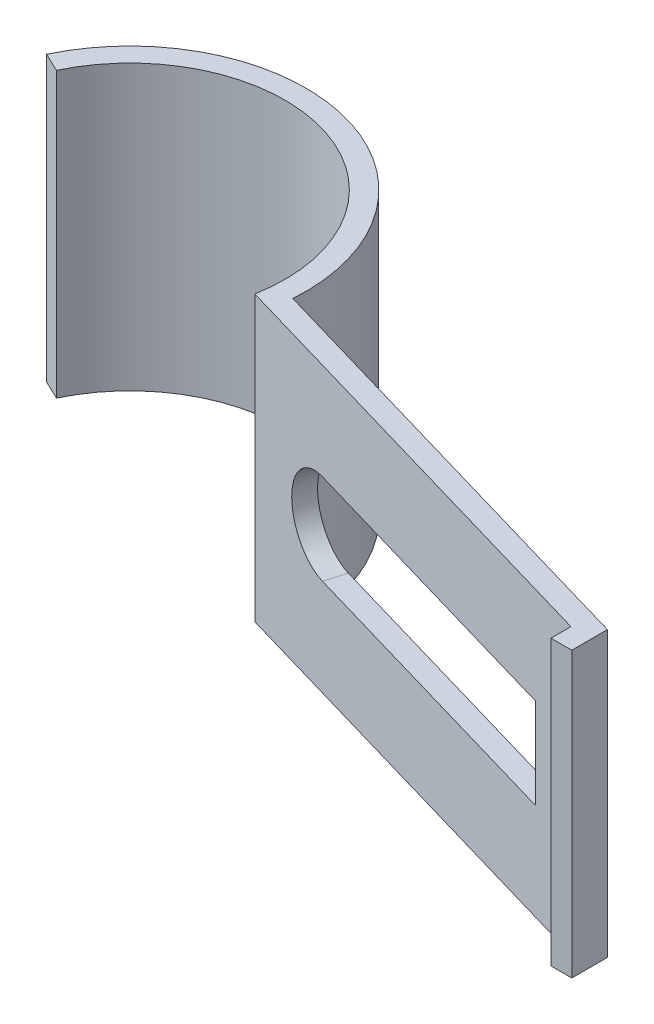
ISO-10303-21;
HEADER;
FILE_DESCRIPTION(('STEP AP214'),'2;1');
FILE_NAME('part.step','',(''),(''),'','','');
FILE_SCHEMA(('AUTOMOTIVE_DESIGN { 1 0 10303 214 1 1 1 1 }'));
ENDSEC;
DATA;
#1=APPLICATION_CONTEXT('core data for automotive mechanical design processes');
#2=APPLICATION_PROTOCOL_DEFINITION('international standard','automotive_design',2000,#1);
#3=PRODUCT_CONTEXT('',#1,'mechanical');
#4=PRODUCT('Part','Part','',(#3));
#5=PRODUCT_RELATED_PRODUCT_CATEGORY('part','',(#4));
#6=PRODUCT_DEFINITION_FORMATION('','',#4);
#7=PRODUCT_DEFINITION_CONTEXT('part definition',#1,'design');
#8=PRODUCT_DEFINITION('design','',#6,#7);
#9=PRODUCT_DEFINITION_SHAPE('','',#8);
#10=(LENGTH_UNIT() NAMED_UNIT(*) SI_UNIT(.MILLI.,.METRE.));
#11=(NAMED_UNIT(*) PLANE_ANGLE_UNIT() SI_UNIT($,.RADIAN.));
#12=(NAMED_UNIT(*) SI_UNIT($,.STERADIAN.) SOLID_ANGLE_UNIT());
#13=UNCERTAINTY_MEASURE_WITH_UNIT(LENGTH_MEASURE(1.E-05),#10,'distance_accuracy_value','');
#14=(GEOMETRIC_REPRESENTATION_CONTEXT(3) GLOBAL_UNCERTAINTY_ASSIGNED_CONTEXT((#13)) GLOBAL_UNIT_ASSIGNED_CONTEXT((#10,
#11,#12)) REPRESENTATION_CONTEXT('',''));
#15=CARTESIAN_POINT('',(0.,0.,0.));
#16=DIRECTION('',(0.,0.,1.));
#17=DIRECTION('',(1.,0.,0.));
#18=AXIS2_PLACEMENT_3D('',#15,#16,#17);
#19=CARTESIAN_POINT('',(0.15,4.08,0.));
#20=DIRECTION('',(0.,0.,-1.));
#21=DIRECTION('',(-1.,0.,0.));
#22=AXIS2_PLACEMENT_3D('',#19,#20,#21);
#23=PLANE('',#22);
#24=DIRECTION('',(1.,0.,0.));
#25=VECTOR('',#24,1.);
#26=CARTESIAN_POINT('',(0.15,0.,0.));
#27=LINE('',#26,#25);
#28=CARTESIAN_POINT('',(-0.15,0.,0.));
#29=VERTEX_POINT('',#28);
#30=CARTESIAN_POINT('',(0.15,0.,0.));
#31=VERTEX_POINT('',#30);
#32=EDGE_CURVE('E171',#29,#31,#27,.T.);
#33=ORIENTED_EDGE('',*,*,#32,.T.);
#34=DIRECTION('',(0.,-1.,0.));
#35=VECTOR('',#34,1.);
#36=CARTESIAN_POINT('',(0.15,4.08,0.));
#37=LINE('',#36,#35);
#38=CARTESIAN_POINT('',(0.15,4.08,0.));
#39=VERTEX_POINT('',#38);
#40=EDGE_CURVE('E11',#39,#31,#37,.T.);
#41=ORIENTED_EDGE('',*,*,#40,.F.);
#42=DIRECTION('',(1.,0.,0.));
#43=VECTOR('',#42,1.);
#44=CARTESIAN_POINT('',(0.15,4.08,0.));
#45=LINE('',#44,#43);
#46=CARTESIAN_POINT('',(-0.15,4.08,0.));
#47=VERTEX_POINT('',#46);
#48=EDGE_CURVE('E173',#47,#39,#45,.T.);
#49=ORIENTED_EDGE('',*,*,#48,.F.);
#50=DIRECTION('',(0.,-1.,0.));
#51=VECTOR('',#50,1.);
#52=CARTESIAN_POINT('',(-0.15,4.08,0.));
#53=LINE('',#52,#51);
#54=EDGE_CURVE('E199',#47,#29,#53,.T.);
#55=ORIENTED_EDGE('',*,*,#54,.T.);
#56=EDGE_LOOP('',(#33,#41,#49,#55));
#57=FACE_BOUND('',#56,.T.);
#58=ADVANCED_FACE('F44',(#57),#23,.F.);
#59=CARTESIAN_POINT('',(0.15,4.08,0.));
#60=DIRECTION('',(-1.,0.,0.));
#61=DIRECTION('',(0.,0.,1.));
#62=AXIS2_PLACEMENT_3D('',#59,#60,#61);
#63=PLANE('',#62);
#64=DIRECTION('',(0.,0.,-1.));
#65=VECTOR('',#64,1.);
#66=CARTESIAN_POINT('',(0.15,0.,0.));
#67=LINE('',#66,#65);
#68=CARTESIAN_POINT('',(0.15,0.,-0.512520873162829));
#69=VERTEX_POINT('',#68);
#70=EDGE_CURVE('E203',#31,#69,#67,.T.);
#71=ORIENTED_EDGE('',*,*,#70,.T.);
#72=DIRECTION('',(0.,-1.,0.));
#73=VECTOR('',#72,1.);
#74=CARTESIAN_POINT('',(0.15,4.08,-0.512520873162829));
#75=LINE('',#74,#73);
#76=CARTESIAN_POINT('',(0.15,4.08,-0.512520873162829));
#77=VERTEX_POINT('',#76);
#78=EDGE_CURVE('E52',#77,#69,#75,.T.);
#79=ORIENTED_EDGE('',*,*,#78,.F.);
#80=DIRECTION('',(0.,0.,-1.));
#81=VECTOR('',#80,1.);
#82=CARTESIAN_POINT('',(0.15,4.08,0.));
#83=LINE('',#82,#81);
#84=EDGE_CURVE('E177',#39,#77,#83,.T.);
#85=ORIENTED_EDGE('',*,*,#84,.F.);
#86=ORIENTED_EDGE('',*,*,#40,.T.);
#87=EDGE_LOOP('',(#71,#79,#85,#86));
#88=FACE_BOUND('',#87,.T.);
#89=ADVANCED_FACE('F272',(#88),#63,.F.);
#90=CARTESIAN_POINT('',(0.15,4.08,-0.512520873162829));
#91=DIRECTION('',(-0.279829014030986,0.,0.960049854385931));
#92=DIRECTION('',(0.960049854385931,0.,0.279829014030986));
#93=AXIS2_PLACEMENT_3D('',#90,#91,#92);
#94=PLANE('',#93);
#95=DIRECTION('',(0.,-1.,0.));
#96=VECTOR('',#95,1.);
#97=CARTESIAN_POINT('',(-0.785140283657693,1.39,-0.785089409433234));
#98=LINE('',#97,#96);
#99=CARTESIAN_POINT('',(-0.785140283657693,2.69,-0.785089409433234));
#100=VERTEX_POINT('',#99);
#101=CARTESIAN_POINT('',(-0.785140283657693,1.39,-0.785089409433234));
#102=VERTEX_POINT('',#101);
#103=EDGE_CURVE('E146',#100,#102,#98,.T.);
#104=ORIENTED_EDGE('',*,*,#103,.F.);
#105=DIRECTION('',(0.960049854385931,0.,0.279829014030985));
#106=VECTOR('',#105,1.);
#107=CARTESIAN_POINT('',(-0.785140283657693,2.69,-0.785089409433234));
#108=LINE('',#107,#106);
#109=CARTESIAN_POINT('',(-5.10536462839438,2.69,-2.04431997257267));
#110=VERTEX_POINT('',#109);
#111=EDGE_CURVE('E59',#110,#100,#108,.T.);
#112=ORIENTED_EDGE('',*,*,#111,.F.);
#113=CARTESIAN_POINT('',(-5.10536462839438,2.04,-2.04431997257267));
#114=DIRECTION('',(0.279829014030986,0.,-0.960049854385931));
#115=DIRECTION('',(0.960049854385931,0.,0.279829014030986));
#116=AXIS2_PLACEMENT_3D('',#113,#114,#115);
#117=CIRCLE('',#116,0.65);
#118=CARTESIAN_POINT('',(-5.10536462839438,1.39,-2.04431997257267));
#119=VERTEX_POINT('',#118);
#120=EDGE_CURVE('E154',#119,#110,#117,.T.);
#121=ORIENTED_EDGE('',*,*,#120,.F.);
#122=DIRECTION('',(-0.960049854385931,0.,-0.279829014030985));
#123=VECTOR('',#122,1.);
#124=CARTESIAN_POINT('',(-0.785140283657693,1.39,-0.785089409433234));
#125=LINE('',#124,#123);
#126=EDGE_CURVE('E136',#102,#119,#125,.T.);
#127=ORIENTED_EDGE('',*,*,#126,.F.);
#128=EDGE_LOOP('',(#104,#112,#121,#127));
#129=FACE_BOUND('',#128,.T.);
#130=DIRECTION('',(-0.96004985438593,0.,-0.279829014030986));
#131=VECTOR('',#130,1.);
#132=CARTESIAN_POINT('',(0.15,0.,-0.512520873162829));
#133=LINE('',#132,#131);
#134=CARTESIAN_POINT('',(-6.2325576157067,0.,-2.37286676711804));
#135=VERTEX_POINT('',#134);
#136=EDGE_CURVE('E206',#69,#135,#133,.T.);
#137=ORIENTED_EDGE('',*,*,#136,.T.);
#138=DIRECTION('',(0.,-1.,0.));
#139=VECTOR('',#138,1.);
#140=CARTESIAN_POINT('',(-6.2325576157067,4.08,-2.37286676711804));
#141=LINE('',#140,#139);
#142=CARTESIAN_POINT('',(-6.2325576157067,4.08,-2.37286676711804));
#143=VERTEX_POINT('',#142);
#144=EDGE_CURVE('E242',#143,#135,#141,.T.);
#145=ORIENTED_EDGE('',*,*,#144,.F.);
#146=DIRECTION('',(-0.96004985438593,0.,-0.279829014030986));
#147=VECTOR('',#146,1.);
#148=CARTESIAN_POINT('',(0.15,4.08,-0.512520873162829));
#149=LINE('',#148,#147);
#150=EDGE_CURVE('E181',#77,#143,#149,.T.);
#151=ORIENTED_EDGE('',*,*,#150,.F.);
#152=ORIENTED_EDGE('',*,*,#78,.T.);
#153=EDGE_LOOP('',(#137,#145,#151,#152));
#154=FACE_BOUND('',#153,.T.);
#155=ADVANCED_FACE('F151',(#129,#154),#94,.F.);
#156=CARTESIAN_POINT('',(-8.75655910648278,4.08,-2.55584044059354));
#157=DIRECTION('',(0.,-1.,0.));
#158=DIRECTION('',(0.,0.,-1.));
#159=AXIS2_PLACEMENT_3D('',#156,#157,#158);
#160=CYLINDRICAL_SURFACE('',#159,2.530625);
#161=CARTESIAN_POINT('',(-8.75655910648278,0.,-2.55584044059354));
#162=DIRECTION('',(0.,1.,0.));
#163=DIRECTION('',(0.,0.,1.));
#164=AXIS2_PLACEMENT_3D('',#161,#162,#163);
#165=CIRCLE('',#164,2.530625);
#166=CARTESIAN_POINT('',(-11.0416102254361,0.,-3.64331654350111));
#167=VERTEX_POINT('',#166);
#168=EDGE_CURVE('E209',#135,#167,#165,.T.);
#169=ORIENTED_EDGE('',*,*,#168,.T.);
#170=DIRECTION('',(0.,-1.,0.));
#171=VECTOR('',#170,1.);
#172=CARTESIAN_POINT('',(-11.0416102254361,4.08,-3.64331654350111));
#173=LINE('',#172,#171);
#174=CARTESIAN_POINT('',(-11.0416102254361,4.08,-3.64331654350111));
#175=VERTEX_POINT('',#174);
#176=EDGE_CURVE('E238',#175,#167,#173,.T.);
#177=ORIENTED_EDGE('',*,*,#176,.F.);
#178=CARTESIAN_POINT('',(-8.75655910648278,4.08,-2.55584044059354));
#179=DIRECTION('',(0.,1.,0.));
#180=DIRECTION('',(0.,0.,1.));
#181=AXIS2_PLACEMENT_3D('',#178,#179,#180);
#182=CIRCLE('',#181,2.530625);
#183=EDGE_CURVE('E184',#143,#175,#182,.T.);
#184=ORIENTED_EDGE('',*,*,#183,.F.);
#185=ORIENTED_EDGE('',*,*,#144,.T.);
#186=EDGE_LOOP('',(#169,#177,#184,#185));
#187=FACE_BOUND('',#186,.T.);
#188=ADVANCED_FACE('F260',(#187),#160,.T.);
#189=CARTESIAN_POINT('',(-11.0416102254361,4.08,-3.64331654350111));
#190=DIRECTION('',(0.429726294060784,0.,-0.902959197413031));
#191=DIRECTION('',(-0.902959197413031,0.,-0.429726294060784));
#192=AXIS2_PLACEMENT_3D('',#189,#190,#191);
#193=PLANE('',#192);
#194=DIRECTION('',(0.902959197413031,0.,0.429726294060784));
#195=VECTOR('',#194,1.);
#196=CARTESIAN_POINT('',(-11.0416102254361,0.,-3.64331654350111));
#197=LINE('',#196,#195);
#198=CARTESIAN_POINT('',(-10.7707224662122,0.,-3.51439865528288));
#199=VERTEX_POINT('',#198);
#200=EDGE_CURVE('E212',#167,#199,#197,.T.);
#201=ORIENTED_EDGE('',*,*,#200,.T.);
#202=DIRECTION('',(0.,-1.,0.));
#203=VECTOR('',#202,1.);
#204=CARTESIAN_POINT('',(-10.7707224662122,4.08,-3.51439865528288));
#205=LINE('',#204,#203);
#206=CARTESIAN_POINT('',(-10.7707224662122,4.08,-3.51439865528288));
#207=VERTEX_POINT('',#206);
#208=EDGE_CURVE('E234',#207,#199,#205,.T.);
#209=ORIENTED_EDGE('',*,*,#208,.F.);
#210=DIRECTION('',(0.902959197413031,0.,0.429726294060784));
#211=VECTOR('',#210,1.);
#212=CARTESIAN_POINT('',(-11.0416102254361,4.08,-3.64331654350111));
#213=LINE('',#212,#211);
#214=EDGE_CURVE('E187',#175,#207,#213,.T.);
#215=ORIENTED_EDGE('',*,*,#214,.F.);
#216=ORIENTED_EDGE('',*,*,#176,.T.);
#217=EDGE_LOOP('',(#201,#209,#215,#216));
#218=FACE_BOUND('',#217,.T.);
#219=ADVANCED_FACE('F264',(#218),#193,.F.);
#220=CARTESIAN_POINT('',(-8.75655910648278,4.08,-2.55584044059354));
#221=DIRECTION('',(0.,-1.,0.));
#222=DIRECTION('',(0.,0.,-1.));
#223=AXIS2_PLACEMENT_3D('',#220,#221,#222);
#224=CYLINDRICAL_SURFACE('',#223,2.230625);
#225=CARTESIAN_POINT('',(-8.75655910648278,0.,-2.55584044059354));
#226=DIRECTION('',(0.,-1.,0.));
#227=DIRECTION('',(0.,0.,1.));
#228=AXIS2_PLACEMENT_3D('',#225,#226,#227);
#229=CIRCLE('',#228,2.230625);
#230=CARTESIAN_POINT('',(-6.56198898734886,0.,-2.15640348332803));
#231=VERTEX_POINT('',#230);
#232=EDGE_CURVE('E215',#199,#231,#229,.T.);
#233=ORIENTED_EDGE('',*,*,#232,.T.);
#234=DIRECTION('',(0.,-1.,0.));
#235=VECTOR('',#234,1.);
#236=CARTESIAN_POINT('',(-6.56198898734886,4.08,-2.15640348332803));
#237=LINE('',#236,#235);
#238=CARTESIAN_POINT('',(-6.56198898734886,4.08,-2.15640348332803));
#239=VERTEX_POINT('',#238);
#240=EDGE_CURVE('E230',#239,#231,#237,.T.);
#241=ORIENTED_EDGE('',*,*,#240,.F.);
#242=CARTESIAN_POINT('',(-8.75655910648278,4.08,-2.55584044059354));
#243=DIRECTION('',(0.,-1.,0.));
#244=DIRECTION('',(0.,0.,1.));
#245=AXIS2_PLACEMENT_3D('',#242,#243,#244);
#246=CIRCLE('',#245,2.230625);
#247=EDGE_CURVE('E190',#207,#239,#246,.T.);
#248=ORIENTED_EDGE('',*,*,#247,.F.);
#249=ORIENTED_EDGE('',*,*,#208,.T.);
#250=EDGE_LOOP('',(#233,#241,#248,#249));
#251=FACE_BOUND('',#250,.T.);
#252=ADVANCED_FACE('F285',(#251),#224,.F.);
#253=CARTESIAN_POINT('',(-0.15,4.08,-0.287479126837171));
#254=DIRECTION('',(0.279829014030986,0.,-0.960049854385931));
#255=DIRECTION('',(-0.960049854385931,0.,-0.279829014030986));
#256=AXIS2_PLACEMENT_3D('',#253,#254,#255);
#257=PLANE('',#256);
#258=CARTESIAN_POINT('',(-5.18931333260368,2.04,-1.75630501625689));
#259=DIRECTION('',(0.279829014030986,0.,-0.960049854385931));
#260=DIRECTION('',(-0.960049854385931,0.,-0.279829014030986));
#261=AXIS2_PLACEMENT_3D('',#258,#259,#260);
#262=CIRCLE('',#261,0.65);
#263=CARTESIAN_POINT('',(-5.18931333260368,2.69,-1.75630501625689));
#264=VERTEX_POINT('',#263);
#265=CARTESIAN_POINT('',(-5.18931333260368,1.39,-1.75630501625689));
#266=VERTEX_POINT('',#265);
#267=EDGE_CURVE('E388',#264,#266,#262,.F.);
#268=ORIENTED_EDGE('',*,*,#267,.F.);
#269=DIRECTION('',(-0.960049854385931,0.,-0.279829014030986));
#270=VECTOR('',#269,1.);
#271=CARTESIAN_POINT('',(-0.869088987866988,2.69,-0.497074453117455));
#272=LINE('',#271,#270);
#273=CARTESIAN_POINT('',(-0.869088987866988,2.69,-0.497074453117455));
#274=VERTEX_POINT('',#273);
#275=EDGE_CURVE('E172',#274,#264,#272,.T.);
#276=ORIENTED_EDGE('',*,*,#275,.F.);
#277=DIRECTION('',(0.,1.,0.));
#278=VECTOR('',#277,1.);
#279=CARTESIAN_POINT('',(-0.869088987866988,1.39,-0.497074453117455));
#280=LINE('',#279,#278);
#281=CARTESIAN_POINT('',(-0.869088987866988,1.39,-0.497074453117455));
#282=VERTEX_POINT('',#281);
#283=EDGE_CURVE('E168',#282,#274,#280,.T.);
#284=ORIENTED_EDGE('',*,*,#283,.F.);
#285=DIRECTION('',(0.960049854385931,0.,0.279829014030986));
#286=VECTOR('',#285,1.);
#287=CARTESIAN_POINT('',(-0.869088987866988,1.39,-0.497074453117455));
#288=LINE('',#287,#286);
#289=EDGE_CURVE('E139',#266,#282,#288,.T.);
#290=ORIENTED_EDGE('',*,*,#289,.F.);
#291=EDGE_LOOP('',(#268,#276,#284,#290));
#292=FACE_BOUND('',#291,.T.);
#293=DIRECTION('',(0.960049854385931,0.,0.279829014030986));
#294=VECTOR('',#293,1.);
#295=CARTESIAN_POINT('',(-0.15,0.,-0.287479126837171));
#296=LINE('',#295,#294);
#297=CARTESIAN_POINT('',(-0.15,0.,-0.287479126837171));
#298=VERTEX_POINT('',#297);
#299=EDGE_CURVE('E218',#231,#298,#296,.T.);
#300=ORIENTED_EDGE('',*,*,#299,.T.);
#301=DIRECTION('',(0.,-1.,0.));
#302=VECTOR('',#301,1.);
#303=CARTESIAN_POINT('',(-0.15,4.08,-0.287479126837171));
#304=LINE('',#303,#302);
#305=CARTESIAN_POINT('',(-0.15,4.08,-0.287479126837171));
#306=VERTEX_POINT('',#305);
#307=EDGE_CURVE('E226',#306,#298,#304,.T.);
#308=ORIENTED_EDGE('',*,*,#307,.F.);
#309=DIRECTION('',(0.960049854385931,0.,0.279829014030986));
#310=VECTOR('',#309,1.);
#311=CARTESIAN_POINT('',(-0.15,4.08,-0.287479126837171));
#312=LINE('',#311,#310);
#313=EDGE_CURVE('E193',#239,#306,#312,.T.);
#314=ORIENTED_EDGE('',*,*,#313,.F.);
#315=ORIENTED_EDGE('',*,*,#240,.T.);
#316=EDGE_LOOP('',(#300,#308,#314,#315));
#317=FACE_BOUND('',#316,.T.);
#318=ADVANCED_FACE('F283',(#292,#317),#257,.F.);
#319=CARTESIAN_POINT('',(-0.15,4.08,0.));
#320=DIRECTION('',(1.,0.,0.));
#321=DIRECTION('',(0.,0.,-1.));
#322=AXIS2_PLACEMENT_3D('',#319,#320,#321);
#323=PLANE('',#322);
#324=DIRECTION('',(0.,0.,1.));
#325=VECTOR('',#324,1.);
#326=CARTESIAN_POINT('',(-0.15,0.,0.));
#327=LINE('',#326,#325);
#328=EDGE_CURVE('E178',#298,#29,#327,.T.);
#329=ORIENTED_EDGE('',*,*,#328,.T.);
#330=ORIENTED_EDGE('',*,*,#54,.F.);
#331=DIRECTION('',(0.,0.,1.));
#332=VECTOR('',#331,1.);
#333=CARTESIAN_POINT('',(-0.15,4.08,0.));
#334=LINE('',#333,#332);
#335=EDGE_CURVE('E196',#306,#47,#334,.T.);
#336=ORIENTED_EDGE('',*,*,#335,.F.);
#337=ORIENTED_EDGE('',*,*,#307,.T.);
#338=EDGE_LOOP('',(#329,#330,#336,#337));
#339=FACE_BOUND('',#338,.T.);
#340=ADVANCED_FACE('F278',(#339),#323,.F.);
#341=CARTESIAN_POINT('',(-8.75655910648278,4.08,-2.55584044059354));
#342=DIRECTION('',(0.,1.,0.));
#343=DIRECTION('',(0.,0.,1.));
#344=AXIS2_PLACEMENT_3D('',#341,#342,#343);
#345=PLANE('',#344);
#346=ORIENTED_EDGE('',*,*,#48,.T.);
#347=ORIENTED_EDGE('',*,*,#84,.T.);
#348=ORIENTED_EDGE('',*,*,#150,.T.);
#349=ORIENTED_EDGE('',*,*,#183,.T.);
#350=ORIENTED_EDGE('',*,*,#214,.T.);
#351=ORIENTED_EDGE('',*,*,#247,.T.);
#352=ORIENTED_EDGE('',*,*,#313,.T.);
#353=ORIENTED_EDGE('',*,*,#335,.T.);
#354=EDGE_LOOP('',(#346,#347,#348,#349,#350,#351,#352,#353));
#355=FACE_BOUND('',#354,.T.);
#356=ADVANCED_FACE('F268',(#355),#345,.T.);
#357=CARTESIAN_POINT('',(-8.75655910648278,0.,-2.55584044059354));
#358=DIRECTION('',(0.,1.,0.));
#359=DIRECTION('',(0.,0.,1.));
#360=AXIS2_PLACEMENT_3D('',#357,#358,#359);
#361=PLANE('',#360);
#362=ORIENTED_EDGE('',*,*,#32,.F.);
#363=ORIENTED_EDGE('',*,*,#328,.F.);
#364=ORIENTED_EDGE('',*,*,#299,.F.);
#365=ORIENTED_EDGE('',*,*,#232,.F.);
#366=ORIENTED_EDGE('',*,*,#200,.F.);
#367=ORIENTED_EDGE('',*,*,#168,.F.);
#368=ORIENTED_EDGE('',*,*,#136,.F.);
#369=ORIENTED_EDGE('',*,*,#70,.F.);
#370=EDGE_LOOP('',(#362,#363,#364,#365,#366,#367,#368,#369));
#371=FACE_BOUND('',#370,.T.);
#372=ADVANCED_FACE('F255',(#371),#361,.F.);
#373=CARTESIAN_POINT('',(-2.35541311722164,2.69,4.60227262101842));
#374=DIRECTION('',(0.,1.,0.));
#375=DIRECTION('',(0.,0.,1.));
#376=AXIS2_PLACEMENT_3D('',#373,#374,#375);
#377=PLANE('',#376);
#378=ORIENTED_EDGE('',*,*,#275,.T.);
#379=DIRECTION('',(0.279829014030986,0.,-0.960049854385931));
#380=VECTOR('',#379,1.);
#381=CARTESIAN_POINT('',(-6.67563746195833,2.69,3.34304205787899));
#382=LINE('',#381,#380);
#383=EDGE_CURVE('E161',#264,#110,#382,.T.);
#384=ORIENTED_EDGE('',*,*,#383,.T.);
#385=ORIENTED_EDGE('',*,*,#111,.T.);
#386=DIRECTION('',(0.279829014030986,0.,-0.960049854385931));
#387=VECTOR('',#386,1.);
#388=CARTESIAN_POINT('',(-2.35541311722164,2.69,4.60227262101842));
#389=LINE('',#388,#387);
#390=EDGE_CURVE('E143',#274,#100,#389,.T.);
#391=ORIENTED_EDGE('',*,*,#390,.F.);
#392=EDGE_LOOP('',(#378,#384,#385,#391));
#393=FACE_BOUND('',#392,.T.);
#394=ADVANCED_FACE('F350',(#393),#377,.F.);
#395=CARTESIAN_POINT('',(-6.67563746195833,2.04,3.34304205787899));
#396=DIRECTION('',(0.279829014030986,0.,-0.960049854385931));
#397=DIRECTION('',(-0.960049854385931,0.,-0.279829014030986));
#398=AXIS2_PLACEMENT_3D('',#395,#396,#397);
#399=CYLINDRICAL_SURFACE('',#398,0.65);
#400=ORIENTED_EDGE('',*,*,#267,.T.);
#401=DIRECTION('',(0.279829014030986,0.,-0.960049854385931));
#402=VECTOR('',#401,1.);
#403=CARTESIAN_POINT('',(-6.67563746195833,1.39,3.34304205787899));
#404=LINE('',#403,#402);
#405=EDGE_CURVE('E142',#266,#119,#404,.T.);
#406=ORIENTED_EDGE('',*,*,#405,.T.);
#407=ORIENTED_EDGE('',*,*,#120,.T.);
#408=ORIENTED_EDGE('',*,*,#383,.F.);
#409=EDGE_LOOP('',(#400,#406,#407,#408));
#410=FACE_BOUND('',#409,.T.);
#411=ADVANCED_FACE('F358',(#410),#399,.F.);
#412=CARTESIAN_POINT('',(-2.35541311722164,1.39,4.60227262101842));
#413=DIRECTION('',(0.,-1.,0.));
#414=DIRECTION('',(0.,0.,-1.));
#415=AXIS2_PLACEMENT_3D('',#412,#413,#414);
#416=PLANE('',#415);
#417=ORIENTED_EDGE('',*,*,#289,.T.);
#418=DIRECTION('',(0.279829014030986,0.,-0.960049854385931));
#419=VECTOR('',#418,1.);
#420=CARTESIAN_POINT('',(-2.35541311722164,1.39,4.60227262101842));
#421=LINE('',#420,#419);
#422=EDGE_CURVE('E67',#282,#102,#421,.T.);
#423=ORIENTED_EDGE('',*,*,#422,.T.);
#424=ORIENTED_EDGE('',*,*,#126,.T.);
#425=ORIENTED_EDGE('',*,*,#405,.F.);
#426=EDGE_LOOP('',(#417,#423,#424,#425));
#427=FACE_BOUND('',#426,.T.);
#428=ADVANCED_FACE('F133',(#427),#416,.F.);
#429=CARTESIAN_POINT('',(-2.35541311722164,1.39,4.60227262101842));
#430=DIRECTION('',(0.960049854385931,0.,0.279829014030986));
#431=DIRECTION('',(0.279829014030986,0.,-0.960049854385931));
#432=AXIS2_PLACEMENT_3D('',#429,#430,#431);
#433=PLANE('',#432);
#434=ORIENTED_EDGE('',*,*,#283,.T.);
#435=ORIENTED_EDGE('',*,*,#390,.T.);
#436=ORIENTED_EDGE('',*,*,#103,.T.);
#437=ORIENTED_EDGE('',*,*,#422,.F.);
#438=EDGE_LOOP('',(#434,#435,#436,#437));
#439=FACE_BOUND('',#438,.T.);
#440=ADVANCED_FACE('F147',(#439),#433,.F.);
#441=CLOSED_SHELL('',(#58,#89,#155,#188,#219,#252,#318,#340,#356,#372,#394,#411,#428,#440));
#442=MANIFOLD_SOLID_BREP('B2',#441);
#443=ADVANCED_BREP_SHAPE_REPRESENTATION('',(#18,#442),#14);
#444=SHAPE_DEFINITION_REPRESENTATION(#9,#443);
ENDSEC;
END-ISO-10303-21;
